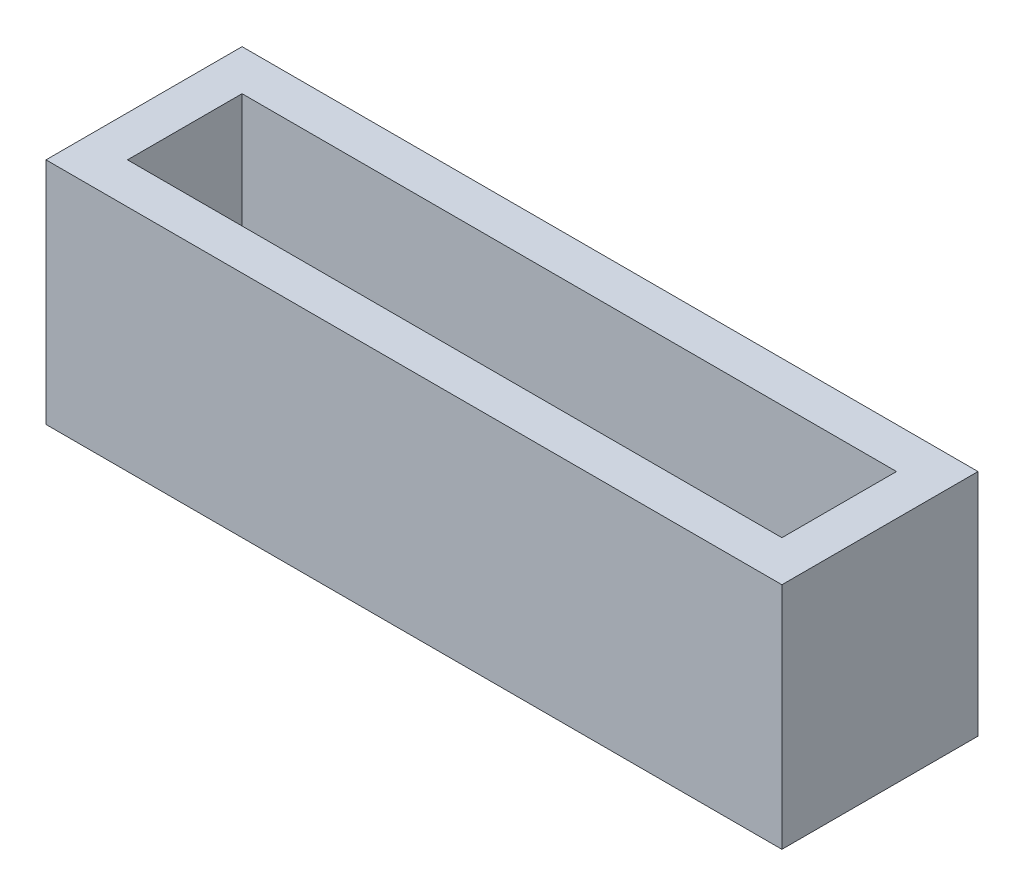
ISO-10303-21;
HEADER;
FILE_DESCRIPTION(('STEP AP214'),'2;1');
FILE_NAME('part.step','',(''),(''),'','','');
FILE_SCHEMA(('AUTOMOTIVE_DESIGN { 1 0 10303 214 1 1 1 1 }'));
ENDSEC;
DATA;
#1=APPLICATION_CONTEXT('core data for automotive mechanical design processes');
#2=APPLICATION_PROTOCOL_DEFINITION('international standard','automotive_design',2000,#1);
#3=PRODUCT_CONTEXT('',#1,'mechanical');
#4=PRODUCT('Part','Part','',(#3));
#5=PRODUCT_RELATED_PRODUCT_CATEGORY('part','',(#4));
#6=PRODUCT_DEFINITION_FORMATION('','',#4);
#7=PRODUCT_DEFINITION_CONTEXT('part definition',#1,'design');
#8=PRODUCT_DEFINITION('design','',#6,#7);
#9=PRODUCT_DEFINITION_SHAPE('','',#8);
#10=(LENGTH_UNIT() NAMED_UNIT(*) SI_UNIT(.MILLI.,.METRE.));
#11=(NAMED_UNIT(*) PLANE_ANGLE_UNIT() SI_UNIT($,.RADIAN.));
#12=(NAMED_UNIT(*) SI_UNIT($,.STERADIAN.) SOLID_ANGLE_UNIT());
#13=UNCERTAINTY_MEASURE_WITH_UNIT(LENGTH_MEASURE(1.E-05),#10,'distance_accuracy_value','');
#14=(GEOMETRIC_REPRESENTATION_CONTEXT(3) GLOBAL_UNCERTAINTY_ASSIGNED_CONTEXT((#13)) GLOBAL_UNIT_ASSIGNED_CONTEXT((#10,
#11,#12)) REPRESENTATION_CONTEXT('',''));
#15=CARTESIAN_POINT('',(0.,0.,0.));
#16=DIRECTION('',(0.,0.,1.));
#17=DIRECTION('',(1.,0.,0.));
#18=AXIS2_PLACEMENT_3D('',#15,#16,#17);
#19=CARTESIAN_POINT('',(0.,9.,-5.40611413043478));
#20=DIRECTION('',(0.,0.,-1.));
#21=DIRECTION('',(-1.,0.,0.));
#22=AXIS2_PLACEMENT_3D('',#19,#20,#21);
#23=PLANE('',#22);
#24=DIRECTION('',(1.,0.,0.));
#25=VECTOR('',#24,1.);
#26=CARTESIAN_POINT('',(0.,0.,-5.40611413043478));
#27=LINE('',#26,#25);
#28=CARTESIAN_POINT('',(-7.32663043478261,0.,-5.40611413043478));
#29=VERTEX_POINT('',#28);
#30=CARTESIAN_POINT('',(21.5733695652174,0.,-5.40611413043478));
#31=VERTEX_POINT('',#30);
#32=EDGE_CURVE('E166',#29,#31,#27,.T.);
#33=ORIENTED_EDGE('',*,*,#32,.F.);
#34=DIRECTION('',(0.,-1.,0.));
#35=VECTOR('',#34,1.);
#36=CARTESIAN_POINT('',(-7.32663043478261,9.,-5.40611413043478));
#37=LINE('',#36,#35);
#38=CARTESIAN_POINT('',(-7.32663043478261,9.,-5.40611413043478));
#39=VERTEX_POINT('',#38);
#40=EDGE_CURVE('E11',#39,#29,#37,.T.);
#41=ORIENTED_EDGE('',*,*,#40,.F.);
#42=DIRECTION('',(1.,0.,0.));
#43=VECTOR('',#42,1.);
#44=CARTESIAN_POINT('',(0.,9.,-5.40611413043478));
#45=LINE('',#44,#43);
#46=CARTESIAN_POINT('',(21.5733695652174,9.,-5.40611413043478));
#47=VERTEX_POINT('',#46);
#48=EDGE_CURVE('E127',#39,#47,#45,.T.);
#49=ORIENTED_EDGE('',*,*,#48,.T.);
#50=DIRECTION('',(0.,-1.,0.));
#51=VECTOR('',#50,1.);
#52=CARTESIAN_POINT('',(21.5733695652174,9.,-5.40611413043478));
#53=LINE('',#52,#51);
#54=EDGE_CURVE('E59',#47,#31,#53,.T.);
#55=ORIENTED_EDGE('',*,*,#54,.T.);
#56=EDGE_LOOP('',(#33,#41,#49,#55));
#57=FACE_BOUND('',#56,.T.);
#58=ADVANCED_FACE('F39',(#57),#23,.T.);
#59=CARTESIAN_POINT('',(-7.32663043478261,9.,0.));
#60=DIRECTION('',(1.,0.,0.));
#61=DIRECTION('',(0.,0.,-1.));
#62=AXIS2_PLACEMENT_3D('',#59,#60,#61);
#63=PLANE('',#62);
#64=DIRECTION('',(0.,0.,1.));
#65=VECTOR('',#64,1.);
#66=CARTESIAN_POINT('',(-7.32663043478261,0.,0.));
#67=LINE('',#66,#65);
#68=CARTESIAN_POINT('',(-7.32663043478261,0.,2.29388586956522));
#69=VERTEX_POINT('',#68);
#70=EDGE_CURVE('E133',#29,#69,#67,.T.);
#71=ORIENTED_EDGE('',*,*,#70,.T.);
#72=DIRECTION('',(0.,-1.,0.));
#73=VECTOR('',#72,1.);
#74=CARTESIAN_POINT('',(-7.32663043478261,9.,2.29388586956522));
#75=LINE('',#74,#73);
#76=CARTESIAN_POINT('',(-7.32663043478261,9.,2.29388586956522));
#77=VERTEX_POINT('',#76);
#78=EDGE_CURVE('E50',#77,#69,#75,.T.);
#79=ORIENTED_EDGE('',*,*,#78,.F.);
#80=DIRECTION('',(0.,0.,1.));
#81=VECTOR('',#80,1.);
#82=CARTESIAN_POINT('',(-7.32663043478261,9.,0.));
#83=LINE('',#82,#81);
#84=EDGE_CURVE('E122',#39,#77,#83,.T.);
#85=ORIENTED_EDGE('',*,*,#84,.F.);
#86=ORIENTED_EDGE('',*,*,#40,.T.);
#87=EDGE_LOOP('',(#71,#79,#85,#86));
#88=FACE_BOUND('',#87,.T.);
#89=ADVANCED_FACE('F131',(#88),#63,.F.);
#90=CARTESIAN_POINT('',(0.,9.,2.29388586956522));
#91=DIRECTION('',(0.,0.,-1.));
#92=DIRECTION('',(-1.,0.,0.));
#93=AXIS2_PLACEMENT_3D('',#90,#91,#92);
#94=PLANE('',#93);
#95=DIRECTION('',(1.,0.,0.));
#96=VECTOR('',#95,1.);
#97=CARTESIAN_POINT('',(0.,0.,2.29388586956522));
#98=LINE('',#97,#96);
#99=CARTESIAN_POINT('',(21.5733695652174,0.,2.29388586956522));
#100=VERTEX_POINT('',#99);
#101=EDGE_CURVE('E161',#69,#100,#98,.T.);
#102=ORIENTED_EDGE('',*,*,#101,.T.);
#103=DIRECTION('',(0.,-1.,0.));
#104=VECTOR('',#103,1.);
#105=CARTESIAN_POINT('',(21.5733695652174,9.,2.29388586956522));
#106=LINE('',#105,#104);
#107=CARTESIAN_POINT('',(21.5733695652174,9.,2.29388586956522));
#108=VERTEX_POINT('',#107);
#109=EDGE_CURVE('E85',#108,#100,#106,.T.);
#110=ORIENTED_EDGE('',*,*,#109,.F.);
#111=DIRECTION('',(1.,0.,0.));
#112=VECTOR('',#111,1.);
#113=CARTESIAN_POINT('',(0.,9.,2.29388586956522));
#114=LINE('',#113,#112);
#115=EDGE_CURVE('E113',#77,#108,#114,.T.);
#116=ORIENTED_EDGE('',*,*,#115,.F.);
#117=ORIENTED_EDGE('',*,*,#78,.T.);
#118=EDGE_LOOP('',(#102,#110,#116,#117));
#119=FACE_BOUND('',#118,.T.);
#120=ADVANCED_FACE('F115',(#119),#94,.F.);
#121=CARTESIAN_POINT('',(0.,9.,-3.80611413043478));
#122=DIRECTION('',(0.,0.,-1.));
#123=DIRECTION('',(-1.,0.,0.));
#124=AXIS2_PLACEMENT_3D('',#121,#122,#123);
#125=PLANE('',#124);
#126=DIRECTION('',(1.,0.,0.));
#127=VECTOR('',#126,1.);
#128=CARTESIAN_POINT('',(0.,0.,-3.80611413043478));
#129=LINE('',#128,#127);
#130=CARTESIAN_POINT('',(-5.72663043478261,0.,-3.80611413043478));
#131=VERTEX_POINT('',#130);
#132=CARTESIAN_POINT('',(19.9733695652174,0.,-3.80611413043478));
#133=VERTEX_POINT('',#132);
#134=EDGE_CURVE('E180',#131,#133,#129,.T.);
#135=ORIENTED_EDGE('',*,*,#134,.T.);
#136=DIRECTION('',(0.,-1.,0.));
#137=VECTOR('',#136,1.);
#138=CARTESIAN_POINT('',(19.9733695652174,9.,-3.80611413043478));
#139=LINE('',#138,#137);
#140=CARTESIAN_POINT('',(19.9733695652174,9.,-3.80611413043478));
#141=VERTEX_POINT('',#140);
#142=EDGE_CURVE('E43',#141,#133,#139,.T.);
#143=ORIENTED_EDGE('',*,*,#142,.F.);
#144=DIRECTION('',(1.,0.,0.));
#145=VECTOR('',#144,1.);
#146=CARTESIAN_POINT('',(0.,9.,-3.80611413043478));
#147=LINE('',#146,#145);
#148=CARTESIAN_POINT('',(-5.72663043478261,9.,-3.80611413043478));
#149=VERTEX_POINT('',#148);
#150=EDGE_CURVE('E160',#149,#141,#147,.T.);
#151=ORIENTED_EDGE('',*,*,#150,.F.);
#152=DIRECTION('',(0.,-1.,0.));
#153=VECTOR('',#152,1.);
#154=CARTESIAN_POINT('',(-5.72663043478261,9.,-3.80611413043478));
#155=LINE('',#154,#153);
#156=EDGE_CURVE('E140',#149,#131,#155,.T.);
#157=ORIENTED_EDGE('',*,*,#156,.T.);
#158=EDGE_LOOP('',(#135,#143,#151,#157));
#159=FACE_BOUND('',#158,.T.);
#160=ADVANCED_FACE('F41',(#159),#125,.F.);
#161=CARTESIAN_POINT('',(19.9733695652174,9.,0.));
#162=DIRECTION('',(1.,0.,0.));
#163=DIRECTION('',(0.,0.,-1.));
#164=AXIS2_PLACEMENT_3D('',#161,#162,#163);
#165=PLANE('',#164);
#166=DIRECTION('',(0.,0.,1.));
#167=VECTOR('',#166,1.);
#168=CARTESIAN_POINT('',(19.9733695652174,0.,0.));
#169=LINE('',#168,#167);
#170=CARTESIAN_POINT('',(19.9733695652174,0.,0.693885869565218));
#171=VERTEX_POINT('',#170);
#172=EDGE_CURVE('E177',#133,#171,#169,.T.);
#173=ORIENTED_EDGE('',*,*,#172,.T.);
#174=DIRECTION('',(0.,-1.,0.));
#175=VECTOR('',#174,1.);
#176=CARTESIAN_POINT('',(19.9733695652174,9.,0.693885869565218));
#177=LINE('',#176,#175);
#178=CARTESIAN_POINT('',(19.9733695652174,9.,0.693885869565218));
#179=VERTEX_POINT('',#178);
#180=EDGE_CURVE('E145',#179,#171,#177,.T.);
#181=ORIENTED_EDGE('',*,*,#180,.F.);
#182=DIRECTION('',(0.,0.,1.));
#183=VECTOR('',#182,1.);
#184=CARTESIAN_POINT('',(19.9733695652174,9.,0.));
#185=LINE('',#184,#183);
#186=EDGE_CURVE('E98',#141,#179,#185,.T.);
#187=ORIENTED_EDGE('',*,*,#186,.F.);
#188=ORIENTED_EDGE('',*,*,#142,.T.);
#189=EDGE_LOOP('',(#173,#181,#187,#188));
#190=FACE_BOUND('',#189,.T.);
#191=ADVANCED_FACE('F211',(#190),#165,.F.);
#192=CARTESIAN_POINT('',(0.,9.,0.693885869565218));
#193=DIRECTION('',(0.,0.,-1.));
#194=DIRECTION('',(-1.,0.,0.));
#195=AXIS2_PLACEMENT_3D('',#192,#193,#194);
#196=PLANE('',#195);
#197=DIRECTION('',(1.,0.,0.));
#198=VECTOR('',#197,1.);
#199=CARTESIAN_POINT('',(0.,0.,0.693885869565218));
#200=LINE('',#199,#198);
#201=CARTESIAN_POINT('',(-5.72663043478261,0.,0.693885869565218));
#202=VERTEX_POINT('',#201);
#203=EDGE_CURVE('E173',#202,#171,#200,.T.);
#204=ORIENTED_EDGE('',*,*,#203,.F.);
#205=DIRECTION('',(0.,-1.,0.));
#206=VECTOR('',#205,1.);
#207=CARTESIAN_POINT('',(-5.72663043478261,9.,0.693885869565218));
#208=LINE('',#207,#206);
#209=CARTESIAN_POINT('',(-5.72663043478261,9.,0.693885869565218));
#210=VERTEX_POINT('',#209);
#211=EDGE_CURVE('E143',#210,#202,#208,.T.);
#212=ORIENTED_EDGE('',*,*,#211,.F.);
#213=DIRECTION('',(1.,0.,0.));
#214=VECTOR('',#213,1.);
#215=CARTESIAN_POINT('',(0.,9.,0.693885869565218));
#216=LINE('',#215,#214);
#217=EDGE_CURVE('E191',#210,#179,#216,.T.);
#218=ORIENTED_EDGE('',*,*,#217,.T.);
#219=ORIENTED_EDGE('',*,*,#180,.T.);
#220=EDGE_LOOP('',(#204,#212,#218,#219));
#221=FACE_BOUND('',#220,.T.);
#222=ADVANCED_FACE('F209',(#221),#196,.T.);
#223=CARTESIAN_POINT('',(-5.72663043478261,9.,0.));
#224=DIRECTION('',(1.,0.,0.));
#225=DIRECTION('',(0.,0.,-1.));
#226=AXIS2_PLACEMENT_3D('',#223,#224,#225);
#227=PLANE('',#226);
#228=DIRECTION('',(0.,0.,1.));
#229=VECTOR('',#228,1.);
#230=CARTESIAN_POINT('',(-5.72663043478261,0.,0.));
#231=LINE('',#230,#229);
#232=EDGE_CURVE('E169',#131,#202,#231,.T.);
#233=ORIENTED_EDGE('',*,*,#232,.F.);
#234=ORIENTED_EDGE('',*,*,#156,.F.);
#235=DIRECTION('',(0.,0.,1.));
#236=VECTOR('',#235,1.);
#237=CARTESIAN_POINT('',(-5.72663043478261,9.,0.));
#238=LINE('',#237,#236);
#239=EDGE_CURVE('E187',#149,#210,#238,.T.);
#240=ORIENTED_EDGE('',*,*,#239,.T.);
#241=ORIENTED_EDGE('',*,*,#211,.T.);
#242=EDGE_LOOP('',(#233,#234,#240,#241));
#243=FACE_BOUND('',#242,.T.);
#244=ADVANCED_FACE('F208',(#243),#227,.T.);
#245=CARTESIAN_POINT('',(21.5733695652174,9.,0.));
#246=DIRECTION('',(1.,0.,0.));
#247=DIRECTION('',(0.,0.,-1.));
#248=AXIS2_PLACEMENT_3D('',#245,#246,#247);
#249=PLANE('',#248);
#250=DIRECTION('',(0.,0.,1.));
#251=VECTOR('',#250,1.);
#252=CARTESIAN_POINT('',(21.5733695652174,0.,0.));
#253=LINE('',#252,#251);
#254=EDGE_CURVE('E156',#31,#100,#253,.T.);
#255=ORIENTED_EDGE('',*,*,#254,.F.);
#256=ORIENTED_EDGE('',*,*,#54,.F.);
#257=DIRECTION('',(0.,0.,1.));
#258=VECTOR('',#257,1.);
#259=CARTESIAN_POINT('',(21.5733695652174,9.,0.));
#260=LINE('',#259,#258);
#261=EDGE_CURVE('E121',#47,#108,#260,.T.);
#262=ORIENTED_EDGE('',*,*,#261,.T.);
#263=ORIENTED_EDGE('',*,*,#109,.T.);
#264=EDGE_LOOP('',(#255,#256,#262,#263));
#265=FACE_BOUND('',#264,.T.);
#266=ADVANCED_FACE('F217',(#265),#249,.T.);
#267=CARTESIAN_POINT('',(0.,9.,0.));
#268=DIRECTION('',(0.,1.,0.));
#269=DIRECTION('',(0.,0.,1.));
#270=AXIS2_PLACEMENT_3D('',#267,#268,#269);
#271=PLANE('',#270);
#272=ORIENTED_EDGE('',*,*,#150,.T.);
#273=ORIENTED_EDGE('',*,*,#186,.T.);
#274=ORIENTED_EDGE('',*,*,#217,.F.);
#275=ORIENTED_EDGE('',*,*,#239,.F.);
#276=EDGE_LOOP('',(#272,#273,#274,#275));
#277=FACE_BOUND('',#276,.T.);
#278=ORIENTED_EDGE('',*,*,#48,.F.);
#279=ORIENTED_EDGE('',*,*,#84,.T.);
#280=ORIENTED_EDGE('',*,*,#115,.T.);
#281=ORIENTED_EDGE('',*,*,#261,.F.);
#282=EDGE_LOOP('',(#278,#279,#280,#281));
#283=FACE_BOUND('',#282,.T.);
#284=ADVANCED_FACE('F126',(#277,#283),#271,.T.);
#285=CARTESIAN_POINT('',(0.,0.,0.));
#286=DIRECTION('',(0.,1.,0.));
#287=DIRECTION('',(0.,0.,1.));
#288=AXIS2_PLACEMENT_3D('',#285,#286,#287);
#289=PLANE('',#288);
#290=ORIENTED_EDGE('',*,*,#134,.F.);
#291=ORIENTED_EDGE('',*,*,#232,.T.);
#292=ORIENTED_EDGE('',*,*,#203,.T.);
#293=ORIENTED_EDGE('',*,*,#172,.F.);
#294=EDGE_LOOP('',(#290,#291,#292,#293));
#295=FACE_BOUND('',#294,.T.);
#296=ORIENTED_EDGE('',*,*,#32,.T.);
#297=ORIENTED_EDGE('',*,*,#254,.T.);
#298=ORIENTED_EDGE('',*,*,#101,.F.);
#299=ORIENTED_EDGE('',*,*,#70,.F.);
#300=EDGE_LOOP('',(#296,#297,#298,#299));
#301=FACE_BOUND('',#300,.T.);
#302=ADVANCED_FACE('F205',(#295,#301),#289,.F.);
#303=CLOSED_SHELL('',(#58,#89,#120,#160,#191,#222,#244,#266,#284,#302));
#304=MANIFOLD_SOLID_BREP('B2',#303);
#305=ADVANCED_BREP_SHAPE_REPRESENTATION('',(#18,#304),#14);
#306=SHAPE_DEFINITION_REPRESENTATION(#9,#305);
ENDSEC;
END-ISO-10303-21;
